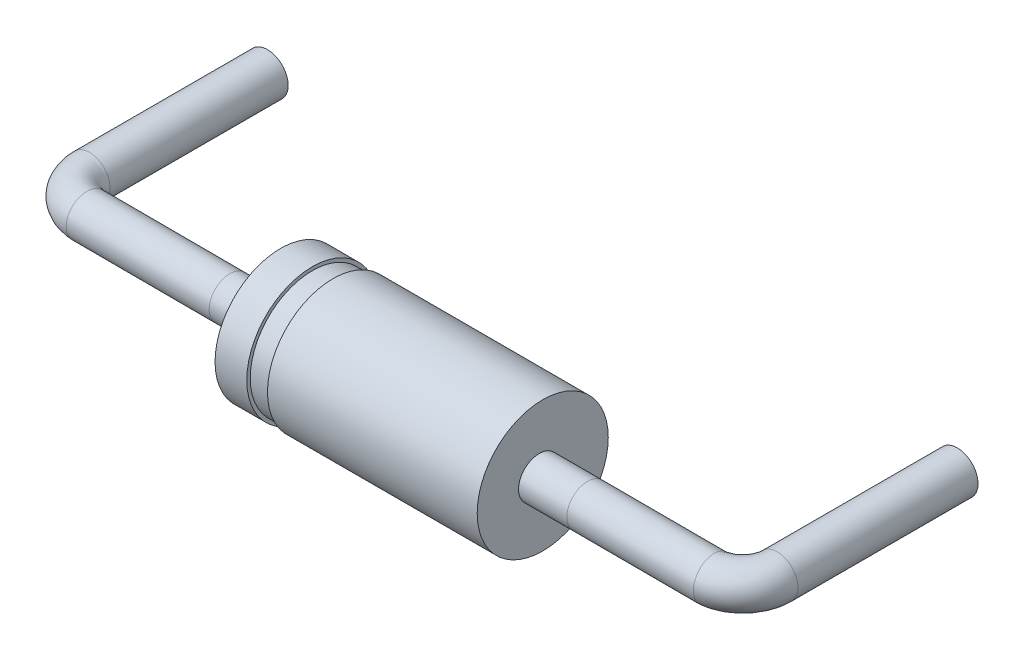
ISO-10303-21;
HEADER;
FILE_DESCRIPTION(('STEP AP214'),'2;1');
FILE_NAME('part.step','',(''),(''),'','','');
FILE_SCHEMA(('AUTOMOTIVE_DESIGN { 1 0 10303 214 1 1 1 1 }'));
ENDSEC;
DATA;
#1=APPLICATION_CONTEXT('core data for automotive mechanical design processes');
#2=APPLICATION_PROTOCOL_DEFINITION('international standard','automotive_design',2000,#1);
#3=PRODUCT_CONTEXT('',#1,'mechanical');
#4=PRODUCT('Part','Part','',(#3));
#5=PRODUCT_RELATED_PRODUCT_CATEGORY('part','',(#4));
#6=PRODUCT_DEFINITION_FORMATION('','',#4);
#7=PRODUCT_DEFINITION_CONTEXT('part definition',#1,'design');
#8=PRODUCT_DEFINITION('design','',#6,#7);
#9=PRODUCT_DEFINITION_SHAPE('','',#8);
#10=(LENGTH_UNIT() NAMED_UNIT(*) SI_UNIT(.MILLI.,.METRE.));
#11=(NAMED_UNIT(*) PLANE_ANGLE_UNIT() SI_UNIT($,.RADIAN.));
#12=(NAMED_UNIT(*) SI_UNIT($,.STERADIAN.) SOLID_ANGLE_UNIT());
#13=UNCERTAINTY_MEASURE_WITH_UNIT(LENGTH_MEASURE(1.E-05),#10,'distance_accuracy_value','');
#14=(GEOMETRIC_REPRESENTATION_CONTEXT(3) GLOBAL_UNCERTAINTY_ASSIGNED_CONTEXT((#13)) GLOBAL_UNIT_ASSIGNED_CONTEXT((#10,
#11,#12)) REPRESENTATION_CONTEXT('',''));
#15=CARTESIAN_POINT('',(0.,0.,0.));
#16=DIRECTION('',(0.,0.,1.));
#17=DIRECTION('',(1.,0.,0.));
#18=AXIS2_PLACEMENT_3D('',#15,#16,#17);
#19=CARTESIAN_POINT('',(9.99999999999972,0.,0.510014731958963));
#20=DIRECTION('',(0.,0.,-1.));
#21=DIRECTION('',(-1.,0.,0.));
#22=AXIS2_PLACEMENT_3D('',#19,#20,#21);
#23=CYLINDRICAL_SURFACE('',#22,0.30000000000016);
#24=CARTESIAN_POINT('',(9.99999999999972,0.,0.510014731958963));
#25=DIRECTION('',(1.44784358113637E-11,0.,1.));
#26=DIRECTION('',(1.,0.,-1.44784358113637E-11));
#27=AXIS2_PLACEMENT_3D('',#24,#25,#26);
#28=CIRCLE('',#27,0.30000000000016);
#29=CARTESIAN_POINT('',(10.2999999999999,0.,0.510014731954619));
#30=VERTEX_POINT('',#29);
#31=EDGE_CURVE('E104',#30,#30,#28,.T.);
#32=ORIENTED_EDGE('',*,*,#31,.F.);
#33=EDGE_LOOP('',(#32));
#34=FACE_BOUND('',#33,.T.);
#35=CARTESIAN_POINT('',(9.99999999999972,0.,-2.1));
#36=DIRECTION('',(0.,0.,-1.));
#37=DIRECTION('',(-1.,0.,0.));
#38=AXIS2_PLACEMENT_3D('',#35,#36,#37);
#39=CIRCLE('',#38,0.30000000000016);
#40=CARTESIAN_POINT('',(9.69999999999956,0.,-2.1));
#41=VERTEX_POINT('',#40);
#42=EDGE_CURVE('E91',#41,#41,#39,.T.);
#43=ORIENTED_EDGE('',*,*,#42,.F.);
#44=EDGE_LOOP('',(#43));
#45=FACE_BOUND('',#44,.T.);
#46=ADVANCED_FACE('F48',(#34,#45),#23,.T.);
#47=CARTESIAN_POINT('',(0.,0.,0.480063554312537));
#48=DIRECTION('',(0.,0.,-1.));
#49=DIRECTION('',(-1.,0.,0.));
#50=AXIS2_PLACEMENT_3D('',#47,#48,#49);
#51=CYLINDRICAL_SURFACE('',#50,0.3);
#52=CARTESIAN_POINT('',(0.,0.,0.480063554312537));
#53=DIRECTION('',(0.,0.,1.));
#54=DIRECTION('',(1.,0.,0.));
#55=AXIS2_PLACEMENT_3D('',#52,#53,#54);
#56=CIRCLE('',#55,0.3);
#57=CARTESIAN_POINT('',(0.3,0.,0.480063554312537));
#58=VERTEX_POINT('',#57);
#59=EDGE_CURVE('E81',#58,#58,#56,.T.);
#60=ORIENTED_EDGE('',*,*,#59,.F.);
#61=EDGE_LOOP('',(#60));
#62=FACE_BOUND('',#61,.T.);
#63=CARTESIAN_POINT('',(0.,0.,-2.1));
#64=DIRECTION('',(0.,0.,-1.));
#65=DIRECTION('',(-1.,0.,0.));
#66=AXIS2_PLACEMENT_3D('',#63,#64,#65);
#67=CIRCLE('',#66,0.3);
#68=CARTESIAN_POINT('',(-0.3,0.,-2.1));
#69=VERTEX_POINT('',#68);
#70=EDGE_CURVE('E85',#69,#69,#67,.T.);
#71=ORIENTED_EDGE('',*,*,#70,.F.);
#72=EDGE_LOOP('',(#71));
#73=FACE_BOUND('',#72,.T.);
#74=ADVANCED_FACE('F154',(#62,#73),#51,.T.);
#75=CARTESIAN_POINT('',(7.74,0.,0.95));
#76=DIRECTION('',(-1.,0.,0.));
#77=DIRECTION('',(0.,0.,1.));
#78=AXIS2_PLACEMENT_3D('',#75,#76,#77);
#79=CYLINDRICAL_SURFACE('',#78,0.95);
#80=CARTESIAN_POINT('',(4.,0.,0.95));
#81=DIRECTION('',(-1.,0.,0.));
#82=DIRECTION('',(0.,0.,1.));
#83=AXIS2_PLACEMENT_3D('',#80,#81,#82);
#84=CIRCLE('',#83,0.95);
#85=CARTESIAN_POINT('',(4.,0.,1.9));
#86=VERTEX_POINT('',#85);
#87=EDGE_CURVE('E190',#86,#86,#84,.T.);
#88=ORIENTED_EDGE('',*,*,#87,.F.);
#89=EDGE_LOOP('',(#88));
#90=FACE_BOUND('',#89,.T.);
#91=CARTESIAN_POINT('',(7.04,0.,0.95));
#92=DIRECTION('',(1.,0.,0.));
#93=DIRECTION('',(0.,0.,-1.));
#94=AXIS2_PLACEMENT_3D('',#91,#92,#93);
#95=CIRCLE('',#94,0.95);
#96=CARTESIAN_POINT('',(7.04,0.,0.));
#97=VERTEX_POINT('',#96);
#98=EDGE_CURVE('E88',#97,#97,#95,.T.);
#99=ORIENTED_EDGE('',*,*,#98,.F.);
#100=EDGE_LOOP('',(#99));
#101=FACE_BOUND('',#100,.T.);
#102=ADVANCED_FACE('F162',(#90,#101),#79,.T.);
#103=CARTESIAN_POINT('',(3.7,0.,0.95));
#104=DIRECTION('',(1.,0.,0.));
#105=DIRECTION('',(0.,0.,-1.));
#106=AXIS2_PLACEMENT_3D('',#103,#104,#105);
#107=CIRCLE('',#106,0.95);
#108=CARTESIAN_POINT('',(3.7,0.,0.));
#109=VERTEX_POINT('',#108);
#110=EDGE_CURVE('E61',#109,#109,#107,.T.);
#111=ORIENTED_EDGE('',*,*,#110,.F.);
#112=EDGE_LOOP('',(#111));
#113=FACE_BOUND('',#112,.T.);
#114=CARTESIAN_POINT('',(3.24,0.,0.95));
#115=DIRECTION('',(-1.,0.,0.));
#116=DIRECTION('',(0.,0.,1.));
#117=AXIS2_PLACEMENT_3D('',#114,#115,#116);
#118=CIRCLE('',#117,0.95);
#119=CARTESIAN_POINT('',(3.24,0.,1.9));
#120=VERTEX_POINT('',#119);
#121=EDGE_CURVE('E100',#120,#120,#118,.T.);
#122=ORIENTED_EDGE('',*,*,#121,.F.);
#123=EDGE_LOOP('',(#122));
#124=FACE_BOUND('',#123,.T.);
#125=ADVANCED_FACE('F50',(#113,#124),#79,.T.);
#126=CARTESIAN_POINT('',(3.7,0.,-0.15));
#127=DIRECTION('',(1.,0.,0.));
#128=DIRECTION('',(0.,0.,-1.));
#129=AXIS2_PLACEMENT_3D('',#126,#127,#128);
#130=PLANE('',#129);
#131=CARTESIAN_POINT('',(3.7,0.,0.95));
#132=DIRECTION('',(-1.,0.,0.));
#133=DIRECTION('',(0.,0.,1.));
#134=AXIS2_PLACEMENT_3D('',#131,#132,#133);
#135=CIRCLE('',#134,0.9);
#136=CARTESIAN_POINT('',(3.7,0.,1.85));
#137=VERTEX_POINT('',#136);
#138=EDGE_CURVE('E187',#137,#137,#135,.T.);
#139=ORIENTED_EDGE('',*,*,#138,.T.);
#140=EDGE_LOOP('',(#139));
#141=FACE_BOUND('',#140,.T.);
#142=ORIENTED_EDGE('',*,*,#110,.T.);
#143=EDGE_LOOP('',(#142));
#144=FACE_BOUND('',#143,.T.);
#145=ADVANCED_FACE('F171',(#141,#144),#130,.T.);
#146=CARTESIAN_POINT('',(4.,0.,-0.15));
#147=DIRECTION('',(-1.,0.,0.));
#148=DIRECTION('',(0.,0.,1.));
#149=AXIS2_PLACEMENT_3D('',#146,#147,#148);
#150=PLANE('',#149);
#151=CARTESIAN_POINT('',(4.,0.,0.95));
#152=DIRECTION('',(-1.,0.,0.));
#153=DIRECTION('',(0.,0.,1.));
#154=AXIS2_PLACEMENT_3D('',#151,#152,#153);
#155=CIRCLE('',#154,0.9);
#156=CARTESIAN_POINT('',(4.,0.,1.85));
#157=VERTEX_POINT('',#156);
#158=EDGE_CURVE('E80',#157,#157,#155,.T.);
#159=ORIENTED_EDGE('',*,*,#158,.F.);
#160=EDGE_LOOP('',(#159));
#161=FACE_BOUND('',#160,.T.);
#162=ORIENTED_EDGE('',*,*,#87,.T.);
#163=EDGE_LOOP('',(#162));
#164=FACE_BOUND('',#163,.T.);
#165=ADVANCED_FACE('F167',(#161,#164),#150,.T.);
#166=CARTESIAN_POINT('',(0.,0.,0.95));
#167=DIRECTION('',(-1.,0.,0.));
#168=DIRECTION('',(0.,0.,1.));
#169=AXIS2_PLACEMENT_3D('',#166,#167,#168);
#170=CYLINDRICAL_SURFACE('',#169,0.9);
#171=ORIENTED_EDGE('',*,*,#158,.T.);
#172=EDGE_LOOP('',(#171));
#173=FACE_BOUND('',#172,.T.);
#174=ORIENTED_EDGE('',*,*,#138,.F.);
#175=EDGE_LOOP('',(#174));
#176=FACE_BOUND('',#175,.T.);
#177=ADVANCED_FACE('F170',(#173,#176),#170,.T.);
#178=CARTESIAN_POINT('',(3.24,0.,0.95));
#179=DIRECTION('',(-1.,0.,0.));
#180=DIRECTION('',(0.,0.,1.));
#181=AXIS2_PLACEMENT_3D('',#178,#179,#180);
#182=PLANE('',#181);
#183=CARTESIAN_POINT('',(3.24,7.77017989880835E-10,0.985347410148689));
#184=DIRECTION('',(-1.,0.,0.));
#185=DIRECTION('',(0.,0.,1.));
#186=AXIS2_PLACEMENT_3D('',#183,#184,#185);
#187=CIRCLE('',#186,0.300000660757027);
#188=CARTESIAN_POINT('',(3.24,7.77017989880835E-10,1.28534807090572));
#189=VERTEX_POINT('',#188);
#190=EDGE_CURVE('E97',#189,#189,#187,.T.);
#191=ORIENTED_EDGE('',*,*,#190,.F.);
#192=EDGE_LOOP('',(#191));
#193=FACE_BOUND('',#192,.T.);
#194=ORIENTED_EDGE('',*,*,#121,.T.);
#195=EDGE_LOOP('',(#194));
#196=FACE_BOUND('',#195,.T.);
#197=ADVANCED_FACE('F175',(#193,#196),#182,.T.);
#198=CARTESIAN_POINT('',(3.24,7.77017989880835E-10,0.985347410148689));
#199=DIRECTION('',(-1.,0.,0.));
#200=DIRECTION('',(0.,0.,1.));
#201=AXIS2_PLACEMENT_3D('',#198,#199,#200);
#202=CYLINDRICAL_SURFACE('',#201,0.300000660757027);
#203=ORIENTED_EDGE('',*,*,#190,.T.);
#204=EDGE_LOOP('',(#203));
#205=FACE_BOUND('',#204,.T.);
#206=CARTESIAN_POINT('',(2.54,7.77017989880835E-10,0.985347410148689));
#207=DIRECTION('',(-1.,0.,0.));
#208=DIRECTION('',(0.,0.,1.));
#209=AXIS2_PLACEMENT_3D('',#206,#207,#208);
#210=CIRCLE('',#209,0.300000660757027);
#211=CARTESIAN_POINT('',(2.54,0.259705103873882,1.1355261565814));
#212=VERTEX_POINT('',#211);
#213=CARTESIAN_POINT('',(2.54,0.299636526628782,1.00012404136617));
#214=VERTEX_POINT('',#213);
#215=EDGE_CURVE('E96',#212,#214,#210,.T.);
#216=ORIENTED_EDGE('',*,*,#215,.F.);
#217=CARTESIAN_POINT('',(2.54,0.,0.685346749391662));
#218=CARTESIAN_POINT('',(2.54,-0.0168644830019289,0.685344950775865));
#219=CARTESIAN_POINT('',(2.54,-0.0337179618552558,0.686770627276738));
#220=CARTESIAN_POINT('',(2.54,-0.0669729464715345,0.692432131120942));
#221=CARTESIAN_POINT('',(2.54,-0.0833738834887279,0.69667134061174));
#222=CARTESIAN_POINT('',(2.54,-0.115208252077361,0.707837588549254));
#223=CARTESIAN_POINT('',(2.54,-0.130642905412303,0.714761149800146));
#224=CARTESIAN_POINT('',(2.54,-0.160152789833537,0.731110935004289));
#225=CARTESIAN_POINT('',(2.54,-0.174226114293957,0.74054060162461));
#226=CARTESIAN_POINT('',(2.54,-0.200570075180384,0.761615519299605));
#227=CARTESIAN_POINT('',(2.54,-0.212843181403974,0.773257683592061));
#228=CARTESIAN_POINT('',(2.54,-0.235278026289906,0.798453763589257));
#229=CARTESIAN_POINT('',(2.54,-0.245436791446977,0.812010327265667));
#230=CARTESIAN_POINT('',(2.54,-0.263319899421839,0.840617391545498));
#231=CARTESIAN_POINT('',(2.54000000000001,-0.27104760937106,0.855665787530246));
#232=CARTESIAN_POINT('',(2.53999999999999,-0.283877849859041,0.886867705624668));
#233=CARTESIAN_POINT('',(2.53999999999997,-0.288976696097797,0.903022742967148));
#234=CARTESIAN_POINT('',(2.53999999999997,-0.296382684017879,0.935936730414062));
#235=CARTESIAN_POINT('',(2.53999999999999,-0.298693701386382,0.95269480868237));
#236=CARTESIAN_POINT('',(2.54000000000001,-0.300472725670439,0.986384848353794));
#237=CARTESIAN_POINT('',(2.54,-0.299936754411622,1.00331702005465));
#238=CARTESIAN_POINT('',(2.54,-0.296030540386886,1.03682713365299));
#239=CARTESIAN_POINT('',(2.54,-0.292664248898558,1.05340553636367));
#240=CARTESIAN_POINT('',(2.54,-0.283191436141278,1.08578535351039));
#241=CARTESIAN_POINT('',(2.54,-0.277081091799389,1.10158564967447));
#242=CARTESIAN_POINT('',(2.54,-0.262302833255873,1.13191382074362));
#243=CARTESIAN_POINT('',(2.54,-0.253638501647454,1.14644344130848));
#244=CARTESIAN_POINT('',(2.54,-0.233982476512821,1.17386227989336));
#245=CARTESIAN_POINT('',(2.54,-0.222987549032459,1.18674917825141));
#246=CARTESIAN_POINT('',(2.54,-0.199001022475903,1.21047626894915));
#247=CARTESIAN_POINT('',(2.54,-0.186012242523925,1.22131930363428));
#248=CARTESIAN_POINT('',(2.54,-0.158398251877823,1.24068482745402));
#249=CARTESIAN_POINT('',(2.54,-0.143770771395884,1.24920404033854));
#250=CARTESIAN_POINT('',(2.54,-0.0980820115556314,1.2708399272636));
#251=CARTESIAN_POINT('',(2.54,-0.0651063178712045,1.28014015135192));
#252=CARTESIAN_POINT('',(2.54,0.00206043272453477,1.28723710278432));
#253=CARTESIAN_POINT('',(2.54,0.0362514855175345,1.28503386910481));
#254=CARTESIAN_POINT('',(2.54,0.0854527750241463,1.27342435155996));
#255=CARTESIAN_POINT('',(2.54,0.101537545450794,1.2681503301828));
#256=CARTESIAN_POINT('',(2.54,0.132588714763305,1.25498366779647));
#257=CARTESIAN_POINT('',(2.54000000000002,0.147556648578101,1.24709470499498));
#258=CARTESIAN_POINT('',(2.53999999999999,0.175972011011524,1.22890476692267));
#259=CARTESIAN_POINT('',(2.53999999999994,0.189417279154621,1.21860042657813));
#260=CARTESIAN_POINT('',(2.54000000000006,0.214369362899857,1.19589531171965));
#261=CARTESIAN_POINT('',(2.54000000000021,0.225878856146647,1.18349748141293));
#262=CARTESIAN_POINT('',(2.54000000000019,0.246669031252345,1.15692788229397));
#263=CARTESIAN_POINT('',(2.54000000000001,0.255946567885113,1.14275365247411));
#264=CARTESIAN_POINT('',(2.53999999999999,0.271977335300976,1.11306889660811));
#265=CARTESIAN_POINT('',(2.54000000000014,0.278734070874768,1.0975602630707));
#266=CARTESIAN_POINT('',(2.54000000000017,0.289557499430184,1.06560670082825));
#267=CARTESIAN_POINT('',(2.54000000000005,0.293620408197705,1.04916049008822));
#268=CARTESIAN_POINT('',(2.53999999999996,0.298921795513846,1.01584267913067));
#269=CARTESIAN_POINT('',(2.53999999999999,0.30016420823246,0.99897170467068));
#270=CARTESIAN_POINT('',(2.54000000000001,0.299800715632464,0.965236675267173));
#271=CARTESIAN_POINT('',(2.54,0.298190819151066,0.948372663098651));
#272=CARTESIAN_POINT('',(2.54,0.292164986301935,0.915178134089007));
#273=CARTESIAN_POINT('',(2.54,0.287752969547082,0.898846905484138));
#274=CARTESIAN_POINT('',(2.54,0.276243464197313,0.867133841629081));
#275=CARTESIAN_POINT('',(2.54,0.269142231670395,0.851753364902874));
#276=CARTESIAN_POINT('',(2.54,0.252468514186909,0.822424640313405));
#277=CARTESIAN_POINT('',(2.54,0.242899490572232,0.808474424351635));
#278=CARTESIAN_POINT('',(2.54,0.221541611733653,0.782358933563136));
#279=CARTESIAN_POINT('',(2.54,0.209749697619353,0.770196159950227));
#280=CARTESIAN_POINT('',(2.54,0.184308231817811,0.74803987034935));
#281=CARTESIAN_POINT('',(2.54,0.170661264245006,0.738043386075041));
#282=CARTESIAN_POINT('',(2.54,0.141863335541866,0.720470477729832));
#283=CARTESIAN_POINT('',(2.54,0.126710459245966,0.712897188381437));
#284=CARTESIAN_POINT('',(2.54,0.0953728832405908,0.700410645771472));
#285=CARTESIAN_POINT('',(2.54,0.0791894466007289,0.695494203801077));
#286=CARTESIAN_POINT('',(2.54,0.0421132055852841,0.687574781753594));
#287=CARTESIAN_POINT('',(2.54,0.0210480323472529,0.685348994187632));
#288=CARTESIAN_POINT('',(2.54,0.,0.685346749391662));
#289=B_SPLINE_CURVE_WITH_KNOTS('',3,(#217,#218,#219,#220,#221,#222,#223,#224,#225,#226,#227,
#228,#229,#230,#231,#232,#233,#234,#235,#236,#237,#238,#239,#240,#241,#242,#243,#244,#245,#246,
#247,#248,#249,#250,#251,#252,#253,#254,#255,#256,#257,#258,#259,#260,#261,#262,#263,#264,#265,
#266,#267,#268,#269,#270,#271,#272,#273,#274,#275,#276,#277,#278,#279,#280,#281,#282,#283,#284,
#285,#286,#287,#288),.UNSPECIFIED.,.T.,.F.,(4,2,2,2,2,2,2,2,2,2,2,2,2,2,2,2,2,2,2,2,2,2,2,2,2,2,
2,2,2,2,2,2,2,2,2,4),(0.,0.0505147970080409,0.101090428095572,0.151600763359162,
0.202180847176869,0.252690875557871,0.303271465800765,0.35378168780673,0.404362507762127,
0.454872928061461,0.505453946490514,0.555964468150709,0.606545581524125,0.657056077420826,
0.707637126368697,0.758147306116397,0.808728334053347,0.90945975561874,1.01019083588258,
1.06077142241418,1.11128116149109,1.16186169279432,1.21237167308539,1.26295241943466,
1.31346257652308,1.3640435394045,1.41455390594703,1.46513500617406,1.51564550879433,
1.56622659231781,1.61673711267996,1.66731765411497,1.71782844476293,1.76840431605434,
1.81891935135842,1.8819652853084),.UNSPECIFIED.);
#290=EDGE_CURVE('E12',#214,#212,#289,.T.);
#291=ORIENTED_EDGE('',*,*,#290,.F.);
#292=EDGE_LOOP('',(#216,#291));
#293=FACE_BOUND('',#292,.T.);
#294=ADVANCED_FACE('F152',(#205,#293),#202,.T.);
#295=CARTESIAN_POINT('',(0.3,0.,0.480063554312537));
#296=CARTESIAN_POINT('',(0.3,0.,0.51323146065287));
#297=CARTESIAN_POINT('',(0.302630094502653,0.,0.510618742647711));
#298=CARTESIAN_POINT('',(0.314069638962755,0.,0.559321440656792));
#299=CARTESIAN_POINT('',(0.331701798304208,0.,0.589640335579595));
#300=CARTESIAN_POINT('',(0.353998054909257,0.,0.618253057956958));
#301=CARTESIAN_POINT('',(0.379306953511115,0.,0.640883126191475));
#302=CARTESIAN_POINT('',(0.40840816185636,0.,0.658359765978233));
#303=CARTESIAN_POINT('',(0.432364813613536,0.,0.670021229069559));
#304=CARTESIAN_POINT('',(0.473265018505979,0.,0.677709716026014));
#305=CARTESIAN_POINT('',(0.459368887351595,0.,0.678026135923725));
#306=CARTESIAN_POINT('',(0.479982925749333,0.,0.679233788617474));
#307=CARTESIAN_POINT('',(0.3,0.6,0.480063554312537));
#308=CARTESIAN_POINT('',(0.3,0.6,0.57293369206547));
#309=CARTESIAN_POINT('',(0.302625482478008,0.6,0.483425940196458));
#310=CARTESIAN_POINT('',(0.314085192552294,0.6,0.56626174204021));
#311=CARTESIAN_POINT('',(0.331647626477338,0.6,0.587911815213187));
#312=CARTESIAN_POINT('',(0.354183186484197,0.6,0.618682128799686));
#313=CARTESIAN_POINT('',(0.378660674433736,0.6,0.640733854462875));
#314=CARTESIAN_POINT('',(0.41077775757639,0.6,0.658525678580015));
#315=CARTESIAN_POINT('',(0.424768081316177,0.6,0.669569933749052));
#316=CARTESIAN_POINT('',(0.497287781020558,0.6,0.679118548140238));
#317=CARTESIAN_POINT('',(0.413965483023066,0.6,0.675366223174713));
#318=CARTESIAN_POINT('',(0.479982925749333,0.6,0.679233788617474));
#319=CARTESIAN_POINT('',(-0.3,0.6,0.480063554312537));
#320=CARTESIAN_POINT('',(-0.3,0.6,0.57293369206547));
#321=CARTESIAN_POINT('',(-0.289473726316436,0.6,0.620413007888075));
#322=CARTESIAN_POINT('',(-0.243741326713408,0.6,0.792467674753128));
#323=CARTESIAN_POINT('',(-0.173123557522595,0.6,0.919524967444903));
#324=CARTESIAN_POINT('',(-0.084244438914924,0.6,1.03252888775737));
#325=CARTESIAN_POINT('',(0.0180539695603919,0.6,1.12346451473663));
#326=CARTESIAN_POINT('',(0.130603530988656,0.6,1.19305288173173));
#327=CARTESIAN_POINT('',(0.239170356672687,0.6,1.24046733409405));
#328=CARTESIAN_POINT('',(0.362351146370861,0.6,1.26884816104593));
#329=CARTESIAN_POINT('',(0.395515912497958,0.6,1.27531411701771));
#330=CARTESIAN_POINT('',(0.461533355224225,0.6,1.27918168246047));
#331=CARTESIAN_POINT('',(-0.3,0.,0.480063554312537));
#332=CARTESIAN_POINT('',(-0.3,0.,0.54308257635917));
#333=CARTESIAN_POINT('',(-0.289471420304114,0.,0.634009409113702));
#334=CARTESIAN_POINT('',(-0.243749103508177,0.,0.788997524061419));
#335=CARTESIAN_POINT('',(-0.173096471609161,0.,0.920389227628107));
#336=CARTESIAN_POINT('',(-0.0843370047023941,0.,1.03231435233601));
#337=CARTESIAN_POINT('',(0.0183771090990814,0.,1.12353915060093));
#338=CARTESIAN_POINT('',(0.129418733128642,0.,1.19296992543084));
#339=CARTESIAN_POINT('',(0.242968722821367,0.,1.2406929817543));
#340=CARTESIAN_POINT('',(0.350339765113571,0.,1.26814374498882));
#341=CARTESIAN_POINT('',(0.418217614662223,0.,1.27664407339222));
#342=CARTESIAN_POINT('',(0.461533355224225,0.,1.27918168246047));
#343=CARTESIAN_POINT('',(-0.3,-0.6,0.480063554312537));
#344=CARTESIAN_POINT('',(-0.3,-0.6,0.51323146065287));
#345=CARTESIAN_POINT('',(-0.289469114291791,-0.6,0.647605810339328));
#346=CARTESIAN_POINT('',(-0.243756880302946,-0.6,0.78552737336971));
#347=CARTESIAN_POINT('',(-0.173069385695726,-0.6,0.921253487811311));
#348=CARTESIAN_POINT('',(-0.0844295704898643,-0.6,1.03209981691464));
#349=CARTESIAN_POINT('',(0.0187002486377709,-0.6,1.12361378646523));
#350=CARTESIAN_POINT('',(0.128233935268627,-0.6,1.19288696912995));
#351=CARTESIAN_POINT('',(0.246767088970046,-0.6,1.24091862941456));
#352=CARTESIAN_POINT('',(0.338328383856282,-0.6,1.26743932893171));
#353=CARTESIAN_POINT('',(0.440919316826488,-0.6,1.27797402976672));
#354=CARTESIAN_POINT('',(0.461533355224225,-0.6,1.27918168246047));
#355=CARTESIAN_POINT('',(0.3,-0.6,0.480063554312537));
#356=CARTESIAN_POINT('',(0.3,-0.6,0.45352922924027));
#357=CARTESIAN_POINT('',(0.302634706527298,-0.6,0.537811545098965));
#358=CARTESIAN_POINT('',(0.314054085373217,-0.6,0.552381139273375));
#359=CARTESIAN_POINT('',(0.331755970131077,-0.6,0.591368855946004));
#360=CARTESIAN_POINT('',(0.353812923334316,-0.6,0.617823987114231));
#361=CARTESIAN_POINT('',(0.379953232588494,-0.6,0.641032397920075));
#362=CARTESIAN_POINT('',(0.406038566136331,-0.6,0.658193853376452));
#363=CARTESIAN_POINT('',(0.439961545910894,-0.6,0.670472524390066));
#364=CARTESIAN_POINT('',(0.449242255991401,-0.6,0.67630088391179));
#365=CARTESIAN_POINT('',(0.504772291680124,-0.6,0.680686048672736));
#366=CARTESIAN_POINT('',(0.479982925749333,-0.6,0.679233788617474));
#367=CARTESIAN_POINT('',(0.3,0.,0.480063554312537));
#368=CARTESIAN_POINT('',(0.3,0.,0.51323146065287));
#369=CARTESIAN_POINT('',(0.302630094502653,0.,0.510618742647711));
#370=CARTESIAN_POINT('',(0.314069638962755,0.,0.559321440656792));
#371=CARTESIAN_POINT('',(0.331701798304208,0.,0.589640335579595));
#372=CARTESIAN_POINT('',(0.353998054909257,0.,0.618253057956958));
#373=CARTESIAN_POINT('',(0.379306953511115,0.,0.640883126191475));
#374=CARTESIAN_POINT('',(0.40840816185636,0.,0.658359765978233));
#375=CARTESIAN_POINT('',(0.432364813613536,0.,0.670021229069559));
#376=CARTESIAN_POINT('',(0.473265018505979,0.,0.677709716026014));
#377=CARTESIAN_POINT('',(0.459368887351595,0.,0.678026135923725));
#378=CARTESIAN_POINT('',(0.479982925749333,0.,0.679233788617474));
#379=(BOUNDED_SURFACE() B_SPLINE_SURFACE(3,3,((#295,#296,#297,#298,#299,#300,#301,#302,#303,
#304,#305,#306),(#307,#308,#309,#310,#311,#312,#313,#314,#315,#316,#317,#318),(#319,#320,#321,
#322,#323,#324,#325,#326,#327,#328,#329,#330),(#331,#332,#333,#334,#335,#336,#337,#338,#339,
#340,#341,#342),(#343,#344,#345,#346,#347,#348,#349,#350,#351,#352,#353,#354),(#355,#356,#357,
#358,#359,#360,#361,#362,#363,#364,#365,#366),(#367,#368,#369,#370,#371,#372,#373,#374,#375,
#376,#377,#378)),.UNSPECIFIED.,.T.,.F.,.F.) B_SPLINE_SURFACE_WITH_KNOTS((4,3,4),(4,1,1,1,1,1,1,
1,1,4),(0.,0.5,1.),(0.,0.131984962298504,0.261406865810533,0.385988843536211,0.503951052347518,
0.614105272063106,0.726270392073853,0.827964847557216,0.91955274538618,1.),
.UNSPECIFIED.) GEOMETRIC_REPRESENTATION_ITEM() RATIONAL_B_SPLINE_SURFACE(((1.,1.,1.,1.,1.,1.,1.,
1.,1.,1.,1.,1.),(0.333333333333333,0.333333333333333,0.333333333333333,0.333333333333333,
0.333333333333333,0.333333333333333,0.333333333333333,0.333333333333333,0.333333333333333,
0.333333333333333,0.333333333333333,0.333333333333333),(0.333333333333333,0.333333333333333,
0.333333333333333,0.333333333333333,0.333333333333333,0.333333333333333,0.333333333333333,
0.333333333333333,0.333333333333333,0.333333333333333,0.333333333333333,0.333333333333333),(1.,
1.,1.,1.,1.,1.,1.,1.,1.,1.,1.,1.),(0.333333333333333,0.333333333333333,0.333333333333333,
0.333333333333333,0.333333333333333,0.333333333333333,0.333333333333333,0.333333333333333,
0.333333333333333,0.333333333333333,0.333333333333333,0.333333333333333),(0.333333333333333,
0.333333333333333,0.333333333333333,0.333333333333333,0.333333333333333,0.333333333333333,
0.333333333333333,0.333333333333333,0.333333333333333,0.333333333333333,0.333333333333333,
0.333333333333333),(1.,1.,1.,1.,1.,1.,1.,1.,1.,1.,1.,1.))) REPRESENTATION_ITEM('') SURFACE());
#380=CARTESIAN_POINT('',(0.479982925754314,0.,0.679233788617489));
#381=CARTESIAN_POINT('',(0.479982925754314,-0.6,0.679233788617489));
#382=CARTESIAN_POINT('',(0.461533355229207,-0.6,1.27918168246049));
#383=CARTESIAN_POINT('',(0.461533355229207,0.,1.27918168246049));
#384=CARTESIAN_POINT('',(0.461533355229207,0.6,1.27918168246049));
#385=CARTESIAN_POINT('',(0.479982925754314,0.6,0.679233788617489));
#386=CARTESIAN_POINT('',(0.479982925754314,0.,0.679233788617489));
#387=(BOUNDED_CURVE() B_SPLINE_CURVE(3,(#380,#381,#382,#383,#384,#385,#386),.UNSPECIFIED.,.T.,
.F.) B_SPLINE_CURVE_WITH_KNOTS((4,3,4),(0.,0.5,1.),
.UNSPECIFIED.) CURVE() GEOMETRIC_REPRESENTATION_ITEM() RATIONAL_B_SPLINE_CURVE((1.,
0.333333333333333,0.333333333333333,1.,0.333333333333333,0.333333333333333,1.)) REPRESENTATION_ITEM(''));
#388=CARTESIAN_POINT('',(0.479982925754314,0.,0.679233788617489));
#389=VERTEX_POINT('',#388);
#390=EDGE_CURVE('E107',#389,#389,#387,.T.);
#391=ORIENTED_EDGE('',*,*,#59,.T.);
#392=EDGE_LOOP('',(#391));
#393=FACE_BOUND('',#392,.T.);
#394=ORIENTED_EDGE('',*,*,#390,.T.);
#395=EDGE_LOOP('',(#394));
#396=FACE_BOUND('',#395,.T.);
#397=ADVANCED_FACE('F141',(#393,#396),#379,.T.);
#398=CARTESIAN_POINT('',(0.479982925754314,0.,0.679233788617489));
#399=CARTESIAN_POINT('',(9.5436102788398,0.,0.706129487286114));
#400=CARTESIAN_POINT('',(0.479982925754314,-0.6,0.679233788617489));
#401=CARTESIAN_POINT('',(9.5436102788398,-0.6,0.706129487286114));
#402=CARTESIAN_POINT('',(0.461533355229207,-0.6,1.27918168246049));
#403=CARTESIAN_POINT('',(9.57992709660458,-0.6,1.30623989666723));
#404=CARTESIAN_POINT('',(0.461533355229207,0.,1.27918168246049));
#405=CARTESIAN_POINT('',(9.57992709660458,0.,1.30623989666723));
#406=CARTESIAN_POINT('',(0.461533355229207,0.6,1.27918168246049));
#407=CARTESIAN_POINT('',(9.57992709660458,0.6,1.30623989666723));
#408=CARTESIAN_POINT('',(0.479982925754314,0.6,0.679233788617489));
#409=CARTESIAN_POINT('',(9.5436102788398,0.6,0.706129487286114));
#410=CARTESIAN_POINT('',(0.479982925754314,0.,0.679233788617489));
#411=CARTESIAN_POINT('',(9.5436102788398,0.,0.706129487286114));
#412=(BOUNDED_SURFACE() B_SPLINE_SURFACE(3,1,((#398,#399),(#400,#401),(#402,#403),(#404,#405),
(#406,#407),(#408,#409),(#410,#411)),.UNSPECIFIED.,.T.,.F.,.F.) B_SPLINE_SURFACE_WITH_KNOTS((4,
3,4),(2,2),(0.,0.5,1.),(0.,1.),
.UNSPECIFIED.) GEOMETRIC_REPRESENTATION_ITEM() RATIONAL_B_SPLINE_SURFACE(((1.,1.),
(0.333333333333333,0.333333333333333),(0.333333333333333,0.333333333333333),(1.,1.),
(0.333333333333333,0.333333333333333),(0.333333333333333,0.333333333333333),(1.,1.))) REPRESENTATION_ITEM('') SURFACE());
#413=ORIENTED_EDGE('',*,*,#390,.F.);
#414=EDGE_LOOP('',(#413));
#415=FACE_BOUND('',#414,.T.);
#416=ORIENTED_EDGE('',*,*,#290,.T.);
#417=ORIENTED_EDGE('',*,*,#215,.T.);
#418=EDGE_LOOP('',(#416,#417));
#419=FACE_BOUND('',#418,.T.);
#420=ADVANCED_FACE('F137',(#415,#419),#412,.F.);
#421=CARTESIAN_POINT('',(7.04,0.,0.95));
#422=DIRECTION('',(1.,0.,0.));
#423=DIRECTION('',(0.,0.,-1.));
#424=AXIS2_PLACEMENT_3D('',#421,#422,#423);
#425=PLANE('',#424);
#426=CARTESIAN_POINT('',(7.04,7.77017935670726E-10,1.00077805702201));
#427=DIRECTION('',(1.,0.,0.));
#428=DIRECTION('',(0.,0.,-1.));
#429=AXIS2_PLACEMENT_3D('',#426,#427,#428);
#430=CIRCLE('',#429,0.300000660757027);
#431=CARTESIAN_POINT('',(7.04,7.77017935670726E-10,0.700777396264985));
#432=VERTEX_POINT('',#431);
#433=EDGE_CURVE('E84',#432,#432,#430,.T.);
#434=ORIENTED_EDGE('',*,*,#433,.F.);
#435=EDGE_LOOP('',(#434));
#436=FACE_BOUND('',#435,.T.);
#437=ORIENTED_EDGE('',*,*,#98,.T.);
#438=EDGE_LOOP('',(#437));
#439=FACE_BOUND('',#438,.T.);
#440=ADVANCED_FACE('F203',(#436,#439),#425,.T.);
#441=CARTESIAN_POINT('',(7.04,7.77017935670726E-10,1.00077805702201));
#442=DIRECTION('',(1.,0.,0.));
#443=DIRECTION('',(0.,0.,-1.));
#444=AXIS2_PLACEMENT_3D('',#441,#442,#443);
#445=CYLINDRICAL_SURFACE('',#444,0.300000660757027);
#446=ORIENTED_EDGE('',*,*,#433,.T.);
#447=EDGE_LOOP('',(#446));
#448=FACE_BOUND('',#447,.T.);
#449=CARTESIAN_POINT('',(7.74,7.77017935670726E-10,1.00077805702201));
#450=DIRECTION('',(1.,0.,0.));
#451=DIRECTION('',(0.,0.,-1.));
#452=AXIS2_PLACEMENT_3D('',#449,#450,#451);
#453=CIRCLE('',#452,0.300000660757027);
#454=CARTESIAN_POINT('',(7.74,7.77017961644668E-10,0.700777396264985));
#455=VERTEX_POINT('',#454);
#456=CARTESIAN_POINT('',(7.74,0.300000661507258,1.00078206602374));
#457=VERTEX_POINT('',#456);
#458=EDGE_CURVE('E68',#455,#457,#453,.T.);
#459=ORIENTED_EDGE('',*,*,#458,.F.);
#460=CARTESIAN_POINT('',(7.74,0.,0.700777396264985));
#461=CARTESIAN_POINT('',(7.74,-0.0168644830019288,0.700775597649188));
#462=CARTESIAN_POINT('',(7.74,-0.0337179618552557,0.702201274150061));
#463=CARTESIAN_POINT('',(7.74,-0.0669729464715343,0.707862777994265));
#464=CARTESIAN_POINT('',(7.73999999999999,-0.0833738834887278,0.712101987485062));
#465=CARTESIAN_POINT('',(7.73999999999999,-0.115208252077361,0.723268235422576));
#466=CARTESIAN_POINT('',(7.74,-0.130642905412302,0.730191796673469));
#467=CARTESIAN_POINT('',(7.74,-0.160152789833536,0.746541581877612));
#468=CARTESIAN_POINT('',(7.74,-0.174226114293957,0.755971248497933));
#469=CARTESIAN_POINT('',(7.74,-0.200570075180384,0.777046166172927));
#470=CARTESIAN_POINT('',(7.74,-0.212843181403973,0.788688330465384));
#471=CARTESIAN_POINT('',(7.74,-0.235278026289905,0.813884410462579));
#472=CARTESIAN_POINT('',(7.74000000000001,-0.245436791446977,0.827440974138989));
#473=CARTESIAN_POINT('',(7.73999999999999,-0.263319899421839,0.856048038418821));
#474=CARTESIAN_POINT('',(7.73999999999997,-0.27104760937106,0.871096434403569));
#475=CARTESIAN_POINT('',(7.74000000000003,-0.28387784985904,0.90229835249799));
#476=CARTESIAN_POINT('',(7.74000000000013,-0.288976696097797,0.918453389840471));
#477=CARTESIAN_POINT('',(7.74000000000013,-0.296382684017879,0.951367377287385));
#478=CARTESIAN_POINT('',(7.74000000000004,-0.298693701386382,0.968125455555693));
#479=CARTESIAN_POINT('',(7.73999999999996,-0.300472725670439,1.00181549522712));
#480=CARTESIAN_POINT('',(7.73999999999998,-0.299936754411622,1.01874766692797));
#481=CARTESIAN_POINT('',(7.74,-0.296030540386886,1.05225778052631));
#482=CARTESIAN_POINT('',(7.74,-0.292664248898558,1.06883618323699));
#483=CARTESIAN_POINT('',(7.74,-0.283191436141278,1.10121600038371));
#484=CARTESIAN_POINT('',(7.74,-0.277081091799389,1.1170162965478));
#485=CARTESIAN_POINT('',(7.74,-0.262302833255873,1.14734446761694));
#486=CARTESIAN_POINT('',(7.74,-0.253638501647454,1.1618740881818));
#487=CARTESIAN_POINT('',(7.74,-0.233982476512821,1.18929292676668));
#488=CARTESIAN_POINT('',(7.74,-0.222987549032459,1.20217982512473));
#489=CARTESIAN_POINT('',(7.74,-0.199001022475903,1.22590691582247));
#490=CARTESIAN_POINT('',(7.74,-0.186012242523925,1.23674995050761));
#491=CARTESIAN_POINT('',(7.74,-0.158398251877824,1.25611547432734));
#492=CARTESIAN_POINT('',(7.74,-0.143770771395885,1.26463468721186));
#493=CARTESIAN_POINT('',(7.74,-0.0980820115556316,1.28627057413692));
#494=CARTESIAN_POINT('',(7.74,-0.0651063178712046,1.29557079822525));
#495=CARTESIAN_POINT('',(7.73999999999999,0.00206043272453474,1.30266774965764));
#496=CARTESIAN_POINT('',(7.73999999999999,0.0362514855175343,1.30046451597813));
#497=CARTESIAN_POINT('',(7.74000000000001,0.0854527750241462,1.28885499843328));
#498=CARTESIAN_POINT('',(7.74000000000002,0.101537545450794,1.28358097705613));
#499=CARTESIAN_POINT('',(7.73999999999998,0.132588714763305,1.27041431466979));
#500=CARTESIAN_POINT('',(7.73999999999994,0.1475566485781,1.26252535186831));
#501=CARTESIAN_POINT('',(7.74000000000007,0.175972011011524,1.244335413796));
#502=CARTESIAN_POINT('',(7.74000000000024,0.189417279154621,1.23403107345145));
#503=CARTESIAN_POINT('',(7.73999999999976,0.214369362899857,1.21132595859297));
#504=CARTESIAN_POINT('',(7.73999999999911,0.225878856146646,1.19892812828625));
#505=CARTESIAN_POINT('',(7.7399999999992,0.246669031252345,1.17235852916729));
#506=CARTESIAN_POINT('',(7.73999999999995,0.255946567885114,1.15818429934743));
#507=CARTESIAN_POINT('',(7.74000000000006,0.271977335300977,1.12849954348143));
#508=CARTESIAN_POINT('',(7.73999999999942,0.278734070874769,1.11299090994402));
#509=CARTESIAN_POINT('',(7.7399999999993,0.289557499430184,1.08103734770157));
#510=CARTESIAN_POINT('',(7.73999999999981,0.293620408197705,1.06459113696154));
#511=CARTESIAN_POINT('',(7.74000000000019,0.298921795513847,1.031273326004));
#512=CARTESIAN_POINT('',(7.74000000000005,0.30016420823246,1.014402351544));
#513=CARTESIAN_POINT('',(7.73999999999995,0.299800715632464,0.980667322140495));
#514=CARTESIAN_POINT('',(7.73999999999999,0.298190819151066,0.963803309971973));
#515=CARTESIAN_POINT('',(7.74000000000001,0.292164986301935,0.93060878096233));
#516=CARTESIAN_POINT('',(7.74000000000001,0.287752969547082,0.914277552357461));
#517=CARTESIAN_POINT('',(7.74,0.276243464197313,0.882564488502404));
#518=CARTESIAN_POINT('',(7.74,0.269142231670395,0.867184011776197));
#519=CARTESIAN_POINT('',(7.74,0.252468514186909,0.837855287186728));
#520=CARTESIAN_POINT('',(7.74,0.242899490572232,0.823905071224958));
#521=CARTESIAN_POINT('',(7.74,0.221541611733653,0.797789580436459));
#522=CARTESIAN_POINT('',(7.74,0.209749697619354,0.78562680682355));
#523=CARTESIAN_POINT('',(7.74,0.184308231817812,0.763470517222674));
#524=CARTESIAN_POINT('',(7.74,0.170661264245006,0.753474032948364));
#525=CARTESIAN_POINT('',(7.74,0.141863335541866,0.735901124603155));
#526=CARTESIAN_POINT('',(7.74,0.126710459245966,0.728327835254761));
#527=CARTESIAN_POINT('',(7.74,0.0953728832405913,0.715841292644795));
#528=CARTESIAN_POINT('',(7.74,0.0791894466007294,0.7109248506744));
#529=CARTESIAN_POINT('',(7.74,0.0421132055852845,0.703005428626917));
#530=CARTESIAN_POINT('',(7.74,0.0210480323472531,0.700779641060955));
#531=CARTESIAN_POINT('',(7.74,0.,0.700777396264985));
#532=B_SPLINE_CURVE_WITH_KNOTS('',3,(#460,#461,#462,#463,#464,#465,#466,#467,#468,#469,#470,
#471,#472,#473,#474,#475,#476,#477,#478,#479,#480,#481,#482,#483,#484,#485,#486,#487,#488,#489,
#490,#491,#492,#493,#494,#495,#496,#497,#498,#499,#500,#501,#502,#503,#504,#505,#506,#507,#508,
#509,#510,#511,#512,#513,#514,#515,#516,#517,#518,#519,#520,#521,#522,#523,#524,#525,#526,#527,
#528,#529,#530,#531),.UNSPECIFIED.,.T.,.F.,(4,2,2,2,2,2,2,2,2,2,2,2,2,2,2,2,2,2,2,2,2,2,2,2,2,2,
2,2,2,2,2,2,2,2,2,4),(0.,0.0505147970080408,0.101090428095572,0.151600763359162,
0.202180847176869,0.252690875557871,0.303271465800764,0.35378168780673,0.404362507762126,
0.454872928061461,0.505453946490514,0.555964468150709,0.606545581524124,0.657056077420826,
0.707637126368698,0.758147306116397,0.808728334053347,0.90945975561874,1.01019083588258,
1.06077142241418,1.11128116149109,1.16186169279432,1.21237167308539,1.26295241943467,
1.31346257652308,1.3640435394045,1.41455390594703,1.46513500617406,1.51564550879433,
1.56622659231781,1.61673711267996,1.66731765411497,1.71782844476293,1.76840431605434,
1.81891935135842,1.8819652853084),.UNSPECIFIED.);
#533=EDGE_CURVE('E52',#455,#457,#532,.T.);
#534=ORIENTED_EDGE('',*,*,#533,.T.);
#535=EDGE_LOOP('',(#459,#534));
#536=FACE_BOUND('',#535,.T.);
#537=ADVANCED_FACE('F78',(#448,#536),#445,.T.);
#538=CARTESIAN_POINT('',(9.54361027884072,0.,0.706129487286001));
#539=CARTESIAN_POINT('',(9.56889626896831,0.,0.702981609433902));
#540=CARTESIAN_POINT('',(9.53831909191827,0.,0.704982806773688));
#541=CARTESIAN_POINT('',(9.59460747512483,0.,0.689821651643934));
#542=CARTESIAN_POINT('',(9.61778189032108,0.,0.672102088220589));
#543=CARTESIAN_POINT('',(9.64646264709815,0.,0.648152720723182));
#544=CARTESIAN_POINT('',(9.66816339449533,0.,0.619606587135794));
#545=CARTESIAN_POINT('',(9.68596906632013,0.,0.589268290352279));
#546=CARTESIAN_POINT('',(9.69735842842205,0.,0.540571203645222));
#547=CARTESIAN_POINT('',(9.70000000000004,0.,0.543182638304119));
#548=CARTESIAN_POINT('',(9.69999999999956,0.,0.510014731963305));
#549=CARTESIAN_POINT('',(9.54361027884072,0.6,0.706129487286001));
#550=CARTESIAN_POINT('',(9.63318770421863,0.6,0.694977905245023));
#551=CARTESIAN_POINT('',(9.50316319164394,0.6,0.709351920604015));
#552=CARTESIAN_POINT('',(9.60606541433357,0.6,0.688427980662498));
#553=CARTESIAN_POINT('',(9.61507412937012,0.6,0.672310259895615));
#554=CARTESIAN_POINT('',(9.64719355866076,0.6,0.64847787686294));
#555=CARTESIAN_POINT('',(9.66794952058082,0.6,0.617908473518183));
#556=CARTESIAN_POINT('',(9.68603047290869,0.6,0.596199861476605));
#557=CARTESIAN_POINT('',(9.69734021984681,0.6,0.513380989931672));
#558=CARTESIAN_POINT('',(9.70000000000091,0.6,0.602884869717649));
#559=CARTESIAN_POINT('',(9.69999999999956,0.6,0.510014731963305));
#560=CARTESIAN_POINT('',(9.57992709660549,0.6,1.30623989666712));
#561=CARTESIAN_POINT('',(9.6695045219834,0.6,1.29508831462614));
#562=CARTESIAN_POINT('',(9.71128343127373,0.6,1.2826706605489));
#563=CARTESIAN_POINT('',(9.85952435682139,0.6,1.23157415434184));
#564=CARTESIAN_POINT('',(9.97559535361732,0.6,1.1578939038816));
#565=CARTESIAN_POINT('',(10.0846445878867,0.6,1.0624393911629));
#566=CARTESIAN_POINT('',(10.1730064689043,0.6,0.949488046890975));
#567=CARTESIAN_POINT('',(10.2437749447137,0.6,0.822415435206493));
#568=CARTESIAN_POINT('',(10.2894637577488,0.6,0.650365198815157));
#569=CARTESIAN_POINT('',(10.3000000000012,0.6,0.602884869708962));
#570=CARTESIAN_POINT('',(10.2999999999999,0.6,0.510014731954618));
#571=CARTESIAN_POINT('',(9.57992709660549,0.,1.30623989666712));
#572=CARTESIAN_POINT('',(9.63735880435824,0.,1.29909016672058));
#573=CARTESIAN_POINT('',(9.7288613814109,0.,1.28048610363373));
#574=CARTESIAN_POINT('',(9.85379538721702,0.,1.23227098983255));
#575=CARTESIAN_POINT('',(9.9769492340928,0.,1.15778981804409));
#576=CARTESIAN_POINT('',(10.0842791321054,0.,1.06227681309302));
#577=CARTESIAN_POINT('',(10.1731134058616,0.,0.950337103699783));
#578=CARTESIAN_POINT('',(10.2437442414194,0.,0.818949649644331));
#579=CARTESIAN_POINT('',(10.2894728620365,0.,0.663960305671933));
#580=CARTESIAN_POINT('',(10.3000000000008,0.,0.573033754002198));
#581=CARTESIAN_POINT('',(10.2999999999999,0.,0.51001473195462));
#582=CARTESIAN_POINT('',(9.57992709660549,-0.6,1.30623989666712));
#583=CARTESIAN_POINT('',(9.60521308673308,-0.6,1.30309201881502));
#584=CARTESIAN_POINT('',(9.74643933154806,-0.6,1.27830154671857));
#585=CARTESIAN_POINT('',(9.84806641761265,-0.6,1.23296782532327));
#586=CARTESIAN_POINT('',(9.97830311456828,-0.6,1.15768573220657));
#587=CARTESIAN_POINT('',(10.0839136763241,-0.6,1.06211423502314));
#588=CARTESIAN_POINT('',(10.1732203428188,-0.6,0.951186160508588));
#589=CARTESIAN_POINT('',(10.2437135381251,-0.6,0.815483864082167));
#590=CARTESIAN_POINT('',(10.2894819663241,-0.6,0.677555412528707));
#591=CARTESIAN_POINT('',(10.3000000000004,-0.6,0.543182638295432));
#592=CARTESIAN_POINT('',(10.2999999999999,-0.6,0.510014731954618));
#593=CARTESIAN_POINT('',(9.54361027884072,-0.6,0.706129487286001));
#594=CARTESIAN_POINT('',(9.50460483371799,-0.6,0.71098531362278));
#595=CARTESIAN_POINT('',(9.5734749921926,-0.6,0.70061369294336));
#596=CARTESIAN_POINT('',(9.58314953591609,-0.6,0.691215322625368));
#597=CARTESIAN_POINT('',(9.62048965127203,-0.6,0.671893916545567));
#598=CARTESIAN_POINT('',(9.64573173553554,-0.6,0.647827564583418));
#599=CARTESIAN_POINT('',(9.66837726840983,-0.6,0.621304700753409));
#600=CARTESIAN_POINT('',(9.68590765973156,-0.6,0.582336719227952));
#601=CARTESIAN_POINT('',(9.6973766369973,-0.6,0.567761417358772));
#602=CARTESIAN_POINT('',(9.69999999999918,-0.6,0.483480406890589));
#603=CARTESIAN_POINT('',(9.69999999999956,-0.6,0.510014731963305));
#604=CARTESIAN_POINT('',(9.54361027884072,0.,0.706129487286001));
#605=CARTESIAN_POINT('',(9.56889626896831,0.,0.702981609433902));
#606=CARTESIAN_POINT('',(9.53831909191827,0.,0.704982806773688));
#607=CARTESIAN_POINT('',(9.59460747512483,0.,0.689821651643934));
#608=CARTESIAN_POINT('',(9.61778189032108,0.,0.672102088220589));
#609=CARTESIAN_POINT('',(9.64646264709815,0.,0.648152720723182));
#610=CARTESIAN_POINT('',(9.66816339449533,0.,0.619606587135794));
#611=CARTESIAN_POINT('',(9.68596906632013,0.,0.589268290352279));
#612=CARTESIAN_POINT('',(9.69735842842205,0.,0.540571203645222));
#613=CARTESIAN_POINT('',(9.70000000000004,0.,0.543182638304119));
#614=CARTESIAN_POINT('',(9.69999999999956,0.,0.510014731963305));
#615=(BOUNDED_SURFACE() B_SPLINE_SURFACE(3,3,((#538,#539,#540,#541,#542,#543,#544,#545,#546,
#547,#548),(#549,#550,#551,#552,#553,#554,#555,#556,#557,#558,#559),(#560,#561,#562,#563,#564,
#565,#566,#567,#568,#569,#570),(#571,#572,#573,#574,#575,#576,#577,#578,#579,#580,#581),(#582,
#583,#584,#585,#586,#587,#588,#589,#590,#591,#592),(#593,#594,#595,#596,#597,#598,#599,#600,
#601,#602,#603),(#604,#605,#606,#607,#608,#609,#610,#611,#612,#613,#614)),.UNSPECIFIED.,.T.,.F.,
.F.) B_SPLINE_SURFACE_WITH_KNOTS((4,3,4),(4,1,1,1,1,1,1,1,4),(0.,0.5,1.),(0.,0.102128033904814,
0.222098656681346,0.356583886774663,0.471995695024781,0.595588162560312,0.726116356231294,
0.861715482166507,1.),
.UNSPECIFIED.) GEOMETRIC_REPRESENTATION_ITEM() RATIONAL_B_SPLINE_SURFACE(((1.,1.,1.,1.,1.,1.,1.,
1.,1.,1.,1.),(0.333333333333333,0.333333333333333,0.333333333333333,0.333333333333333,
0.333333333333333,0.333333333333333,0.333333333333333,0.333333333333333,0.333333333333333,
0.333333333333333,0.333333333333333),(0.333333333333333,0.333333333333333,0.333333333333333,
0.333333333333333,0.333333333333333,0.333333333333333,0.333333333333333,0.333333333333333,
0.333333333333333,0.333333333333333,0.333333333333333),(1.,1.,1.,1.,1.,1.,1.,1.,1.,1.,1.),
(0.333333333333333,0.333333333333333,0.333333333333333,0.333333333333333,0.333333333333333,
0.333333333333333,0.333333333333333,0.333333333333333,0.333333333333333,0.333333333333333,
0.333333333333333),(0.333333333333333,0.333333333333333,0.333333333333333,0.333333333333333,
0.333333333333333,0.333333333333333,0.333333333333333,0.333333333333333,0.333333333333333,
0.333333333333333,0.333333333333333),(1.,1.,1.,1.,1.,1.,1.,1.,1.,1.,1.))) REPRESENTATION_ITEM('') SURFACE());
#616=CARTESIAN_POINT('',(9.5436102788398,0.,0.706129487286114));
#617=CARTESIAN_POINT('',(9.5436102788398,-0.6,0.706129487286114));
#618=CARTESIAN_POINT('',(9.57992709660458,-0.6,1.30623989666723));
#619=CARTESIAN_POINT('',(9.57992709660458,0.,1.30623989666723));
#620=CARTESIAN_POINT('',(9.57992709660458,0.6,1.30623989666723));
#621=CARTESIAN_POINT('',(9.5436102788398,0.6,0.706129487286114));
#622=CARTESIAN_POINT('',(9.5436102788398,0.,0.706129487286114));
#623=(BOUNDED_CURVE() B_SPLINE_CURVE(3,(#616,#617,#618,#619,#620,#621,#622),.UNSPECIFIED.,.T.,
.F.) B_SPLINE_CURVE_WITH_KNOTS((4,3,4),(0.,0.5,1.),
.UNSPECIFIED.) CURVE() GEOMETRIC_REPRESENTATION_ITEM() RATIONAL_B_SPLINE_CURVE((1.,
0.333333333333333,0.333333333333333,1.,0.333333333333333,0.333333333333333,1.)) REPRESENTATION_ITEM(''));
#624=CARTESIAN_POINT('',(9.5436102788398,0.,0.706129487286114));
#625=VERTEX_POINT('',#624);
#626=EDGE_CURVE('E112',#625,#625,#623,.F.);
#627=ORIENTED_EDGE('',*,*,#626,.T.);
#628=EDGE_LOOP('',(#627));
#629=FACE_BOUND('',#628,.T.);
#630=ORIENTED_EDGE('',*,*,#31,.T.);
#631=EDGE_LOOP('',(#630));
#632=FACE_BOUND('',#631,.T.);
#633=ADVANCED_FACE('F136',(#629,#632),#615,.T.);
#634=ORIENTED_EDGE('',*,*,#533,.F.);
#635=ORIENTED_EDGE('',*,*,#458,.T.);
#636=EDGE_LOOP('',(#634,#635));
#637=FACE_BOUND('',#636,.T.);
#638=ORIENTED_EDGE('',*,*,#626,.F.);
#639=EDGE_LOOP('',(#638));
#640=FACE_BOUND('',#639,.T.);
#641=ADVANCED_FACE('F82',(#637,#640),#412,.F.);
#642=CARTESIAN_POINT('',(0.,0.,-2.1));
#643=DIRECTION('',(0.,0.,-1.));
#644=DIRECTION('',(-1.,0.,0.));
#645=AXIS2_PLACEMENT_3D('',#642,#643,#644);
#646=PLANE('',#645);
#647=ORIENTED_EDGE('',*,*,#70,.T.);
#648=EDGE_LOOP('',(#647));
#649=FACE_BOUND('',#648,.T.);
#650=ADVANCED_FACE('F135',(#649),#646,.T.);
#651=CARTESIAN_POINT('',(9.99999999999972,0.,-2.1));
#652=DIRECTION('',(0.,0.,-1.));
#653=DIRECTION('',(-1.,0.,0.));
#654=AXIS2_PLACEMENT_3D('',#651,#652,#653);
#655=PLANE('',#654);
#656=ORIENTED_EDGE('',*,*,#42,.T.);
#657=EDGE_LOOP('',(#656));
#658=FACE_BOUND('',#657,.T.);
#659=ADVANCED_FACE('F291',(#658),#655,.T.);
#660=CLOSED_SHELL('',(#46,#74,#102,#125,#145,#165,#177,#197,#294,#397,#420,#440,#537,#633,#641,
#650,#659));
#661=MANIFOLD_SOLID_BREP('B2',#660);
#662=ADVANCED_BREP_SHAPE_REPRESENTATION('',(#18,#661),#14);
#663=SHAPE_DEFINITION_REPRESENTATION(#9,#662);
ENDSEC;
END-ISO-10303-21;
